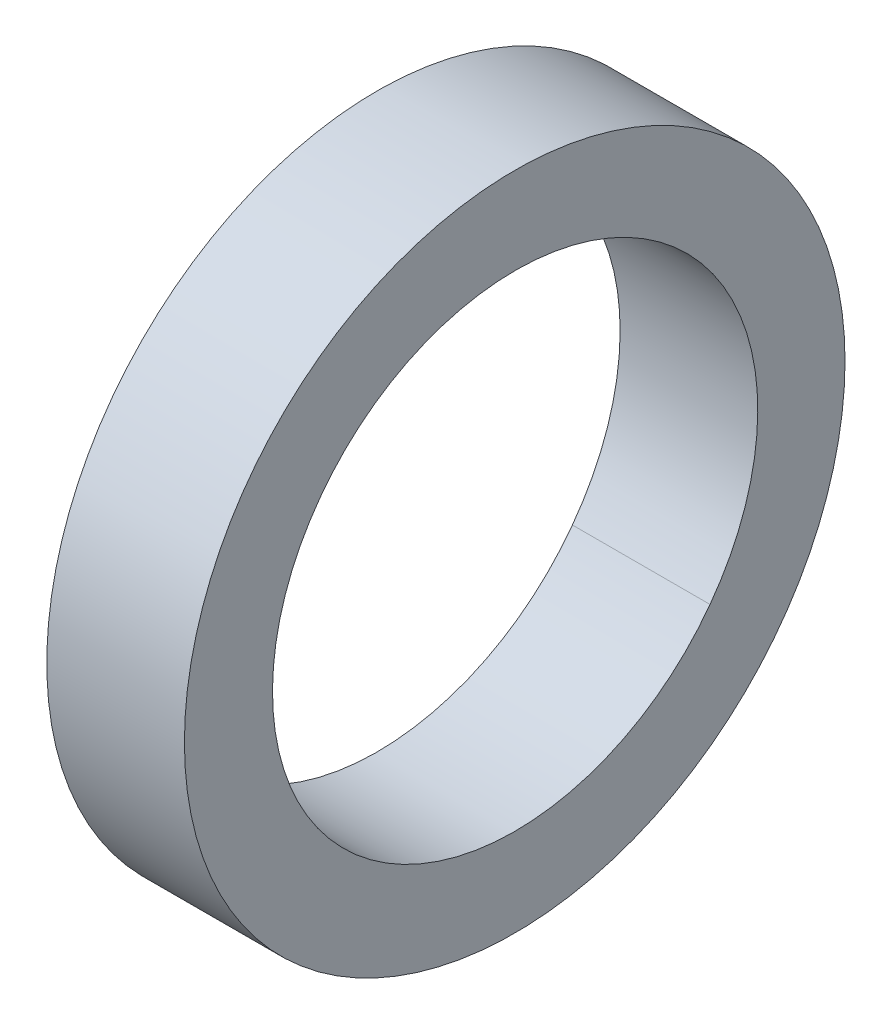
ISO-10303-21;
HEADER;
FILE_DESCRIPTION(('STEP AP214'),'2;1');
FILE_NAME('part.step','',(''),(''),'','','');
FILE_SCHEMA(('AUTOMOTIVE_DESIGN { 1 0 10303 214 1 1 1 1 }'));
ENDSEC;
DATA;
#1=APPLICATION_CONTEXT('core data for automotive mechanical design processes');
#2=APPLICATION_PROTOCOL_DEFINITION('international standard','automotive_design',2000,#1);
#3=PRODUCT_CONTEXT('',#1,'mechanical');
#4=PRODUCT('Part','Part','',(#3));
#5=PRODUCT_RELATED_PRODUCT_CATEGORY('part','',(#4));
#6=PRODUCT_DEFINITION_FORMATION('','',#4);
#7=PRODUCT_DEFINITION_CONTEXT('part definition',#1,'design');
#8=PRODUCT_DEFINITION('design','',#6,#7);
#9=PRODUCT_DEFINITION_SHAPE('','',#8);
#10=(LENGTH_UNIT() NAMED_UNIT(*) SI_UNIT(.MILLI.,.METRE.));
#11=(NAMED_UNIT(*) PLANE_ANGLE_UNIT() SI_UNIT($,.RADIAN.));
#12=(NAMED_UNIT(*) SI_UNIT($,.STERADIAN.) SOLID_ANGLE_UNIT());
#13=UNCERTAINTY_MEASURE_WITH_UNIT(LENGTH_MEASURE(1.E-05),#10,'distance_accuracy_value','');
#14=(GEOMETRIC_REPRESENTATION_CONTEXT(3) GLOBAL_UNCERTAINTY_ASSIGNED_CONTEXT((#13)) GLOBAL_UNIT_ASSIGNED_CONTEXT((#10,
#11,#12)) REPRESENTATION_CONTEXT('',''));
#15=CARTESIAN_POINT('',(0.,0.,0.));
#16=DIRECTION('',(0.,0.,1.));
#17=DIRECTION('',(1.,0.,0.));
#18=AXIS2_PLACEMENT_3D('',#15,#16,#17);
#19=CARTESIAN_POINT('',(-101.,15.,0.));
#20=DIRECTION('',(1.,0.,0.));
#21=DIRECTION('',(0.,0.,-1.));
#22=AXIS2_PLACEMENT_3D('',#19,#20,#21);
#23=CYLINDRICAL_SURFACE('',#22,30.);
#24=CARTESIAN_POINT('',(100.,15.,0.));
#25=DIRECTION('',(-1.,0.,0.));
#26=DIRECTION('',(0.,0.,1.));
#27=AXIS2_PLACEMENT_3D('',#24,#25,#26);
#28=CIRCLE('',#27,30.);
#29=CARTESIAN_POINT('',(100.,15.,30.));
#30=VERTEX_POINT('',#29);
#31=EDGE_CURVE('E76',#30,#30,#28,.F.);
#32=ORIENTED_EDGE('',*,*,#31,.F.);
#33=EDGE_LOOP('',(#32));
#34=FACE_BOUND('',#33,.T.);
#35=CARTESIAN_POINT('',(87.5000000000002,15.,0.));
#36=DIRECTION('',(1.,0.,0.));
#37=DIRECTION('',(0.,0.,-1.));
#38=AXIS2_PLACEMENT_3D('',#35,#36,#37);
#39=CIRCLE('',#38,30.);
#40=CARTESIAN_POINT('',(87.5000000000002,15.,-30.));
#41=VERTEX_POINT('',#40);
#42=EDGE_CURVE('E73',#41,#41,#39,.F.);
#43=ORIENTED_EDGE('',*,*,#42,.F.);
#44=EDGE_LOOP('',(#43));
#45=FACE_BOUND('',#44,.T.);
#46=ADVANCED_FACE('F34',(#34,#45),#23,.T.);
#47=CARTESIAN_POINT('',(87.5,0.,87.5));
#48=DIRECTION('',(1.,0.,0.));
#49=DIRECTION('',(0.,0.,-1.));
#50=AXIS2_PLACEMENT_3D('',#47,#48,#49);
#51=PLANE('',#50);
#52=CARTESIAN_POINT('',(87.5,15.1007728117623,-0.0743773387182023));
#53=DIRECTION('',(1.,0.,0.));
#54=DIRECTION('',(0.,0.,-1.));
#55=AXIS2_PLACEMENT_3D('',#52,#53,#54);
#56=CIRCLE('',#55,22.);
#57=CARTESIAN_POINT('',(87.5,1.98598373428147,-17.7379643881595));
#58=VERTEX_POINT('',#57);
#59=CARTESIAN_POINT('',(87.5,28.1147890774808,17.6635870494413));
#60=VERTEX_POINT('',#59);
#61=EDGE_CURVE('E72',#58,#60,#56,.T.);
#62=ORIENTED_EDGE('',*,*,#61,.T.);
#63=CARTESIAN_POINT('',(87.5000000000002,15.,0.));
#64=DIRECTION('',(1.,0.,0.));
#65=DIRECTION('',(0.,0.,-1.));
#66=AXIS2_PLACEMENT_3D('',#63,#64,#65);
#67=CIRCLE('',#66,22.);
#68=EDGE_CURVE('E53',#58,#60,#67,.F.);
#69=ORIENTED_EDGE('',*,*,#68,.F.);
#70=EDGE_LOOP('',(#62,#69));
#71=FACE_BOUND('',#70,.T.);
#72=ORIENTED_EDGE('',*,*,#42,.T.);
#73=EDGE_LOOP('',(#72));
#74=FACE_BOUND('',#73,.T.);
#75=ADVANCED_FACE('F83',(#71,#74),#51,.F.);
#76=CARTESIAN_POINT('',(100.,30.,-100.));
#77=DIRECTION('',(-1.,0.,0.));
#78=DIRECTION('',(0.,0.,1.));
#79=AXIS2_PLACEMENT_3D('',#76,#77,#78);
#80=PLANE('',#79);
#81=CARTESIAN_POINT('',(100.,15.1007728117623,-0.0743773387182023));
#82=DIRECTION('',(1.,0.,0.));
#83=DIRECTION('',(0.,0.,-1.));
#84=AXIS2_PLACEMENT_3D('',#81,#82,#83);
#85=CIRCLE('',#84,22.);
#86=CARTESIAN_POINT('',(100.,1.98598373428147,-17.7379643881595));
#87=VERTEX_POINT('',#86);
#88=CARTESIAN_POINT('',(100.,28.1147890774808,17.6635870494413));
#89=VERTEX_POINT('',#88);
#90=EDGE_CURVE('E63',#87,#89,#85,.T.);
#91=ORIENTED_EDGE('',*,*,#90,.F.);
#92=CARTESIAN_POINT('',(100.,15.,0.));
#93=DIRECTION('',(1.,0.,0.));
#94=DIRECTION('',(0.,0.,-1.));
#95=AXIS2_PLACEMENT_3D('',#92,#93,#94);
#96=CIRCLE('',#95,22.);
#97=EDGE_CURVE('E49',#89,#87,#96,.T.);
#98=ORIENTED_EDGE('',*,*,#97,.F.);
#99=EDGE_LOOP('',(#91,#98));
#100=FACE_BOUND('',#99,.T.);
#101=ORIENTED_EDGE('',*,*,#31,.T.);
#102=EDGE_LOOP('',(#101));
#103=FACE_BOUND('',#102,.T.);
#104=ADVANCED_FACE('F60',(#100,#103),#80,.F.);
#105=CARTESIAN_POINT('',(-101.,15.,0.));
#106=DIRECTION('',(1.,0.,0.));
#107=DIRECTION('',(0.,0.,-1.));
#108=AXIS2_PLACEMENT_3D('',#105,#106,#107);
#109=CYLINDRICAL_SURFACE('',#108,22.);
#110=ORIENTED_EDGE('',*,*,#97,.T.);
#111=DIRECTION('',(1.,0.,0.));
#112=VECTOR('',#111,1.);
#113=CARTESIAN_POINT('',(-10.,1.98598373428147,-17.7379643881595));
#114=LINE('',#113,#112);
#115=EDGE_CURVE('E11',#58,#87,#114,.T.);
#116=ORIENTED_EDGE('',*,*,#115,.F.);
#117=ORIENTED_EDGE('',*,*,#68,.T.);
#118=DIRECTION('',(1.,0.,0.));
#119=VECTOR('',#118,1.);
#120=CARTESIAN_POINT('',(-10.,28.1147890774808,17.6635870494413));
#121=LINE('',#120,#119);
#122=EDGE_CURVE('E42',#89,#60,#121,.F.);
#123=ORIENTED_EDGE('',*,*,#122,.F.);
#124=EDGE_LOOP('',(#110,#116,#117,#123));
#125=FACE_BOUND('',#124,.T.);
#126=ADVANCED_FACE('F65',(#125),#109,.F.);
#127=CARTESIAN_POINT('',(-101.,15.1007728117623,-0.0743773387182023));
#128=DIRECTION('',(1.,0.,0.));
#129=DIRECTION('',(0.,0.,-1.));
#130=AXIS2_PLACEMENT_3D('',#127,#128,#129);
#131=CYLINDRICAL_SURFACE('',#130,22.);
#132=ORIENTED_EDGE('',*,*,#61,.F.);
#133=ORIENTED_EDGE('',*,*,#115,.T.);
#134=ORIENTED_EDGE('',*,*,#90,.T.);
#135=ORIENTED_EDGE('',*,*,#122,.T.);
#136=EDGE_LOOP('',(#132,#133,#134,#135));
#137=FACE_BOUND('',#136,.T.);
#138=ADVANCED_FACE('F36',(#137),#131,.F.);
#139=CLOSED_SHELL('',(#46,#75,#104,#126,#138));
#140=MANIFOLD_SOLID_BREP('B2',#139);
#141=ADVANCED_BREP_SHAPE_REPRESENTATION('',(#18,#140),#14);
#142=SHAPE_DEFINITION_REPRESENTATION(#9,#141);
ENDSEC;
END-ISO-10303-21;
